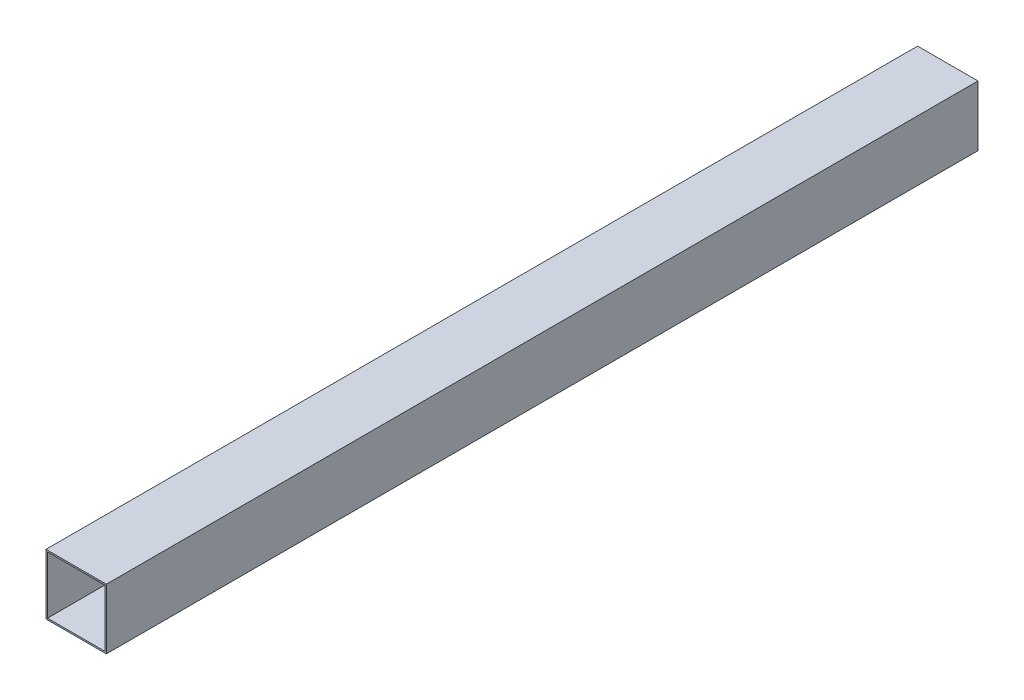
ISO-10303-21;
HEADER;
FILE_DESCRIPTION(('STEP AP214'),'2;1');
FILE_NAME('part.step','',(''),(''),'','','');
FILE_SCHEMA(('AUTOMOTIVE_DESIGN { 1 0 10303 214 1 1 1 1 }'));
ENDSEC;
DATA;
#1=APPLICATION_CONTEXT('core data for automotive mechanical design processes');
#2=APPLICATION_PROTOCOL_DEFINITION('international standard','automotive_design',2000,#1);
#3=PRODUCT_CONTEXT('',#1,'mechanical');
#4=PRODUCT('Part','Part','',(#3));
#5=PRODUCT_RELATED_PRODUCT_CATEGORY('part','',(#4));
#6=PRODUCT_DEFINITION_FORMATION('','',#4);
#7=PRODUCT_DEFINITION_CONTEXT('part definition',#1,'design');
#8=PRODUCT_DEFINITION('design','',#6,#7);
#9=PRODUCT_DEFINITION_SHAPE('','',#8);
#10=(LENGTH_UNIT() NAMED_UNIT(*) SI_UNIT(.MILLI.,.METRE.));
#11=(NAMED_UNIT(*) PLANE_ANGLE_UNIT() SI_UNIT($,.RADIAN.));
#12=(NAMED_UNIT(*) SI_UNIT($,.STERADIAN.) SOLID_ANGLE_UNIT());
#13=UNCERTAINTY_MEASURE_WITH_UNIT(LENGTH_MEASURE(1.E-05),#10,'distance_accuracy_value','');
#14=(GEOMETRIC_REPRESENTATION_CONTEXT(3) GLOBAL_UNCERTAINTY_ASSIGNED_CONTEXT((#13)) GLOBAL_UNIT_ASSIGNED_CONTEXT((#10,
#11,#12)) REPRESENTATION_CONTEXT('',''));
#15=CARTESIAN_POINT('',(0.,0.,0.));
#16=DIRECTION('',(0.,0.,1.));
#17=DIRECTION('',(1.,0.,0.));
#18=AXIS2_PLACEMENT_3D('',#15,#16,#17);
#19=CARTESIAN_POINT('',(0.,0.,1100.));
#20=DIRECTION('',(0.,0.,1.));
#21=DIRECTION('',(1.,0.,0.));
#22=AXIS2_PLACEMENT_3D('',#19,#20,#21);
#23=PLANE('',#22);
#24=DIRECTION('',(0.,-1.,0.));
#25=VECTOR('',#24,1.);
#26=CARTESIAN_POINT('',(0.,0.,1100.));
#27=LINE('',#26,#25);
#28=CARTESIAN_POINT('',(0.,0.,1100.));
#29=VERTEX_POINT('',#28);
#30=CARTESIAN_POINT('',(0.,-76.2,1100.));
#31=VERTEX_POINT('',#30);
#32=EDGE_CURVE('E134',#29,#31,#27,.T.);
#33=ORIENTED_EDGE('',*,*,#32,.T.);
#34=DIRECTION('',(1.,0.,0.));
#35=VECTOR('',#34,1.);
#36=CARTESIAN_POINT('',(0.,-76.2,1100.));
#37=LINE('',#36,#35);
#38=CARTESIAN_POINT('',(76.2,-76.2,1100.));
#39=VERTEX_POINT('',#38);
#40=EDGE_CURVE('E137',#31,#39,#37,.T.);
#41=ORIENTED_EDGE('',*,*,#40,.T.);
#42=DIRECTION('',(0.,1.,0.));
#43=VECTOR('',#42,1.);
#44=CARTESIAN_POINT('',(76.2,0.,1100.));
#45=LINE('',#44,#43);
#46=CARTESIAN_POINT('',(76.2,0.,1100.));
#47=VERTEX_POINT('',#46);
#48=EDGE_CURVE('E140',#39,#47,#45,.T.);
#49=ORIENTED_EDGE('',*,*,#48,.T.);
#50=DIRECTION('',(-1.,0.,0.));
#51=VECTOR('',#50,1.);
#52=CARTESIAN_POINT('',(0.,0.,1100.));
#53=LINE('',#52,#51);
#54=EDGE_CURVE('E142',#47,#29,#53,.T.);
#55=ORIENTED_EDGE('',*,*,#54,.T.);
#56=EDGE_LOOP('',(#33,#41,#49,#55));
#57=FACE_BOUND('',#56,.T.);
#58=DIRECTION('',(-1.,0.,0.));
#59=VECTOR('',#58,1.);
#60=CARTESIAN_POINT('',(1.9,-1.9,1100.));
#61=LINE('',#60,#59);
#62=CARTESIAN_POINT('',(74.3,-1.9,1100.));
#63=VERTEX_POINT('',#62);
#64=CARTESIAN_POINT('',(1.9,-1.9,1100.));
#65=VERTEX_POINT('',#64);
#66=EDGE_CURVE('E106',#63,#65,#61,.T.);
#67=ORIENTED_EDGE('',*,*,#66,.F.);
#68=DIRECTION('',(0.,1.,0.));
#69=VECTOR('',#68,1.);
#70=CARTESIAN_POINT('',(74.3,-74.3,1100.));
#71=LINE('',#70,#69);
#72=CARTESIAN_POINT('',(74.3,-74.3,1100.));
#73=VERTEX_POINT('',#72);
#74=EDGE_CURVE('E98',#73,#63,#71,.T.);
#75=ORIENTED_EDGE('',*,*,#74,.F.);
#76=DIRECTION('',(1.,0.,0.));
#77=VECTOR('',#76,1.);
#78=CARTESIAN_POINT('',(1.9,-74.3,1100.));
#79=LINE('',#78,#77);
#80=CARTESIAN_POINT('',(1.9,-74.3,1100.));
#81=VERTEX_POINT('',#80);
#82=EDGE_CURVE('E120',#81,#73,#79,.T.);
#83=ORIENTED_EDGE('',*,*,#82,.F.);
#84=DIRECTION('',(0.,-1.,0.));
#85=VECTOR('',#84,1.);
#86=CARTESIAN_POINT('',(1.9,-74.3,1100.));
#87=LINE('',#86,#85);
#88=EDGE_CURVE('E118',#65,#81,#87,.T.);
#89=ORIENTED_EDGE('',*,*,#88,.F.);
#90=EDGE_LOOP('',(#67,#75,#83,#89));
#91=FACE_BOUND('',#90,.T.);
#92=ADVANCED_FACE('F33',(#57,#91),#23,.T.);
#93=CARTESIAN_POINT('',(0.,0.,0.));
#94=DIRECTION('',(0.,0.,1.));
#95=DIRECTION('',(1.,0.,0.));
#96=AXIS2_PLACEMENT_3D('',#93,#94,#95);
#97=PLANE('',#96);
#98=DIRECTION('',(0.,-1.,0.));
#99=VECTOR('',#98,1.);
#100=CARTESIAN_POINT('',(0.,0.,0.));
#101=LINE('',#100,#99);
#102=CARTESIAN_POINT('',(0.,0.,0.));
#103=VERTEX_POINT('',#102);
#104=CARTESIAN_POINT('',(0.,-76.2,0.));
#105=VERTEX_POINT('',#104);
#106=EDGE_CURVE('E114',#103,#105,#101,.T.);
#107=ORIENTED_EDGE('',*,*,#106,.F.);
#108=DIRECTION('',(-1.,0.,0.));
#109=VECTOR('',#108,1.);
#110=CARTESIAN_POINT('',(0.,0.,0.));
#111=LINE('',#110,#109);
#112=CARTESIAN_POINT('',(76.2,0.,0.));
#113=VERTEX_POINT('',#112);
#114=EDGE_CURVE('E138',#113,#103,#111,.T.);
#115=ORIENTED_EDGE('',*,*,#114,.F.);
#116=DIRECTION('',(0.,1.,0.));
#117=VECTOR('',#116,1.);
#118=CARTESIAN_POINT('',(76.2,0.,0.));
#119=LINE('',#118,#117);
#120=CARTESIAN_POINT('',(76.2,-76.2,0.));
#121=VERTEX_POINT('',#120);
#122=EDGE_CURVE('E149',#121,#113,#119,.T.);
#123=ORIENTED_EDGE('',*,*,#122,.F.);
#124=DIRECTION('',(1.,0.,0.));
#125=VECTOR('',#124,1.);
#126=CARTESIAN_POINT('',(0.,-76.2,0.));
#127=LINE('',#126,#125);
#128=EDGE_CURVE('E147',#105,#121,#127,.T.);
#129=ORIENTED_EDGE('',*,*,#128,.F.);
#130=EDGE_LOOP('',(#107,#115,#123,#129));
#131=FACE_BOUND('',#130,.T.);
#132=DIRECTION('',(0.,1.,0.));
#133=VECTOR('',#132,1.);
#134=CARTESIAN_POINT('',(74.3,-74.3,0.));
#135=LINE('',#134,#133);
#136=CARTESIAN_POINT('',(74.3,-74.3,0.));
#137=VERTEX_POINT('',#136);
#138=CARTESIAN_POINT('',(74.3,-1.9,0.));
#139=VERTEX_POINT('',#138);
#140=EDGE_CURVE('E56',#137,#139,#135,.T.);
#141=ORIENTED_EDGE('',*,*,#140,.T.);
#142=DIRECTION('',(-1.,0.,0.));
#143=VECTOR('',#142,1.);
#144=CARTESIAN_POINT('',(1.9,-1.9,0.));
#145=LINE('',#144,#143);
#146=CARTESIAN_POINT('',(1.9,-1.9,0.));
#147=VERTEX_POINT('',#146);
#148=EDGE_CURVE('E113',#139,#147,#145,.T.);
#149=ORIENTED_EDGE('',*,*,#148,.T.);
#150=DIRECTION('',(0.,-1.,0.));
#151=VECTOR('',#150,1.);
#152=CARTESIAN_POINT('',(1.9,-74.3,0.));
#153=LINE('',#152,#151);
#154=CARTESIAN_POINT('',(1.9,-74.3,0.));
#155=VERTEX_POINT('',#154);
#156=EDGE_CURVE('E126',#147,#155,#153,.T.);
#157=ORIENTED_EDGE('',*,*,#156,.T.);
#158=DIRECTION('',(1.,0.,0.));
#159=VECTOR('',#158,1.);
#160=CARTESIAN_POINT('',(1.9,-74.3,0.));
#161=LINE('',#160,#159);
#162=EDGE_CURVE('E107',#155,#137,#161,.T.);
#163=ORIENTED_EDGE('',*,*,#162,.T.);
#164=EDGE_LOOP('',(#141,#149,#157,#163));
#165=FACE_BOUND('',#164,.T.);
#166=ADVANCED_FACE('F167',(#131,#165),#97,.F.);
#167=CARTESIAN_POINT('',(0.,0.,1100.));
#168=DIRECTION('',(1.,0.,0.));
#169=DIRECTION('',(0.,1.,0.));
#170=AXIS2_PLACEMENT_3D('',#167,#168,#169);
#171=PLANE('',#170);
#172=ORIENTED_EDGE('',*,*,#106,.T.);
#173=DIRECTION('',(0.,0.,-1.));
#174=VECTOR('',#173,1.);
#175=CARTESIAN_POINT('',(0.,-76.2,1100.));
#176=LINE('',#175,#174);
#177=EDGE_CURVE('E11',#31,#105,#176,.T.);
#178=ORIENTED_EDGE('',*,*,#177,.F.);
#179=ORIENTED_EDGE('',*,*,#32,.F.);
#180=DIRECTION('',(0.,0.,-1.));
#181=VECTOR('',#180,1.);
#182=CARTESIAN_POINT('',(0.,0.,1100.));
#183=LINE('',#182,#181);
#184=EDGE_CURVE('E144',#29,#103,#183,.T.);
#185=ORIENTED_EDGE('',*,*,#184,.T.);
#186=EDGE_LOOP('',(#172,#178,#179,#185));
#187=FACE_BOUND('',#186,.T.);
#188=ADVANCED_FACE('F35',(#187),#171,.F.);
#189=CARTESIAN_POINT('',(0.,-76.2,1100.));
#190=DIRECTION('',(0.,1.,0.));
#191=DIRECTION('',(0.,0.,1.));
#192=AXIS2_PLACEMENT_3D('',#189,#190,#191);
#193=PLANE('',#192);
#194=ORIENTED_EDGE('',*,*,#128,.T.);
#195=DIRECTION('',(0.,0.,-1.));
#196=VECTOR('',#195,1.);
#197=CARTESIAN_POINT('',(76.2,-76.2,1100.));
#198=LINE('',#197,#196);
#199=EDGE_CURVE('E41',#39,#121,#198,.T.);
#200=ORIENTED_EDGE('',*,*,#199,.F.);
#201=ORIENTED_EDGE('',*,*,#40,.F.);
#202=ORIENTED_EDGE('',*,*,#177,.T.);
#203=EDGE_LOOP('',(#194,#200,#201,#202));
#204=FACE_BOUND('',#203,.T.);
#205=ADVANCED_FACE('F177',(#204),#193,.F.);
#206=CARTESIAN_POINT('',(76.2,0.,1100.));
#207=DIRECTION('',(-1.,0.,0.));
#208=DIRECTION('',(0.,-1.,0.));
#209=AXIS2_PLACEMENT_3D('',#206,#207,#208);
#210=PLANE('',#209);
#211=ORIENTED_EDGE('',*,*,#122,.T.);
#212=DIRECTION('',(0.,0.,-1.));
#213=VECTOR('',#212,1.);
#214=CARTESIAN_POINT('',(76.2,0.,1100.));
#215=LINE('',#214,#213);
#216=EDGE_CURVE('E154',#47,#113,#215,.T.);
#217=ORIENTED_EDGE('',*,*,#216,.F.);
#218=ORIENTED_EDGE('',*,*,#48,.F.);
#219=ORIENTED_EDGE('',*,*,#199,.T.);
#220=EDGE_LOOP('',(#211,#217,#218,#219));
#221=FACE_BOUND('',#220,.T.);
#222=ADVANCED_FACE('F161',(#221),#210,.F.);
#223=CARTESIAN_POINT('',(0.,0.,1100.));
#224=DIRECTION('',(0.,-1.,0.));
#225=DIRECTION('',(0.,0.,-1.));
#226=AXIS2_PLACEMENT_3D('',#223,#224,#225);
#227=PLANE('',#226);
#228=ORIENTED_EDGE('',*,*,#114,.T.);
#229=ORIENTED_EDGE('',*,*,#184,.F.);
#230=ORIENTED_EDGE('',*,*,#54,.F.);
#231=ORIENTED_EDGE('',*,*,#216,.T.);
#232=EDGE_LOOP('',(#228,#229,#230,#231));
#233=FACE_BOUND('',#232,.T.);
#234=ADVANCED_FACE('F171',(#233),#227,.F.);
#235=CARTESIAN_POINT('',(74.3,-74.3,1100.));
#236=DIRECTION('',(-1.,0.,0.));
#237=DIRECTION('',(0.,0.,1.));
#238=AXIS2_PLACEMENT_3D('',#235,#236,#237);
#239=PLANE('',#238);
#240=ORIENTED_EDGE('',*,*,#140,.F.);
#241=DIRECTION('',(0.,0.,-1.));
#242=VECTOR('',#241,1.);
#243=CARTESIAN_POINT('',(74.3,-74.3,1100.));
#244=LINE('',#243,#242);
#245=EDGE_CURVE('E102',#73,#137,#244,.T.);
#246=ORIENTED_EDGE('',*,*,#245,.F.);
#247=ORIENTED_EDGE('',*,*,#74,.T.);
#248=DIRECTION('',(0.,0.,-1.));
#249=VECTOR('',#248,1.);
#250=CARTESIAN_POINT('',(74.3,-1.9,1100.));
#251=LINE('',#250,#249);
#252=EDGE_CURVE('E101',#63,#139,#251,.T.);
#253=ORIENTED_EDGE('',*,*,#252,.T.);
#254=EDGE_LOOP('',(#240,#246,#247,#253));
#255=FACE_BOUND('',#254,.T.);
#256=ADVANCED_FACE('F100',(#255),#239,.T.);
#257=CARTESIAN_POINT('',(1.9,-1.9,1100.));
#258=DIRECTION('',(0.,-1.,0.));
#259=DIRECTION('',(0.,0.,-1.));
#260=AXIS2_PLACEMENT_3D('',#257,#258,#259);
#261=PLANE('',#260);
#262=ORIENTED_EDGE('',*,*,#148,.F.);
#263=ORIENTED_EDGE('',*,*,#252,.F.);
#264=ORIENTED_EDGE('',*,*,#66,.T.);
#265=DIRECTION('',(0.,0.,-1.));
#266=VECTOR('',#265,1.);
#267=CARTESIAN_POINT('',(1.9,-1.9,1100.));
#268=LINE('',#267,#266);
#269=EDGE_CURVE('E115',#65,#147,#268,.T.);
#270=ORIENTED_EDGE('',*,*,#269,.T.);
#271=EDGE_LOOP('',(#262,#263,#264,#270));
#272=FACE_BOUND('',#271,.T.);
#273=ADVANCED_FACE('F110',(#272),#261,.T.);
#274=CARTESIAN_POINT('',(1.9,-74.3,1100.));
#275=DIRECTION('',(1.,0.,0.));
#276=DIRECTION('',(0.,0.,-1.));
#277=AXIS2_PLACEMENT_3D('',#274,#275,#276);
#278=PLANE('',#277);
#279=ORIENTED_EDGE('',*,*,#156,.F.);
#280=ORIENTED_EDGE('',*,*,#269,.F.);
#281=ORIENTED_EDGE('',*,*,#88,.T.);
#282=DIRECTION('',(0.,0.,-1.));
#283=VECTOR('',#282,1.);
#284=CARTESIAN_POINT('',(1.9,-74.3,1100.));
#285=LINE('',#284,#283);
#286=EDGE_CURVE('E48',#81,#155,#285,.T.);
#287=ORIENTED_EDGE('',*,*,#286,.T.);
#288=EDGE_LOOP('',(#279,#280,#281,#287));
#289=FACE_BOUND('',#288,.T.);
#290=ADVANCED_FACE('F200',(#289),#278,.T.);
#291=CARTESIAN_POINT('',(1.9,-74.3,1100.));
#292=DIRECTION('',(0.,1.,0.));
#293=DIRECTION('',(0.,0.,1.));
#294=AXIS2_PLACEMENT_3D('',#291,#292,#293);
#295=PLANE('',#294);
#296=ORIENTED_EDGE('',*,*,#162,.F.);
#297=ORIENTED_EDGE('',*,*,#286,.F.);
#298=ORIENTED_EDGE('',*,*,#82,.T.);
#299=ORIENTED_EDGE('',*,*,#245,.T.);
#300=EDGE_LOOP('',(#296,#297,#298,#299));
#301=FACE_BOUND('',#300,.T.);
#302=ADVANCED_FACE('F204',(#301),#295,.T.);
#303=CLOSED_SHELL('',(#92,#166,#188,#205,#222,#234,#256,#273,#290,#302));
#304=MANIFOLD_SOLID_BREP('B2',#303);
#305=ADVANCED_BREP_SHAPE_REPRESENTATION('',(#18,#304),#14);
#306=SHAPE_DEFINITION_REPRESENTATION(#9,#305);
ENDSEC;
END-ISO-10303-21;
